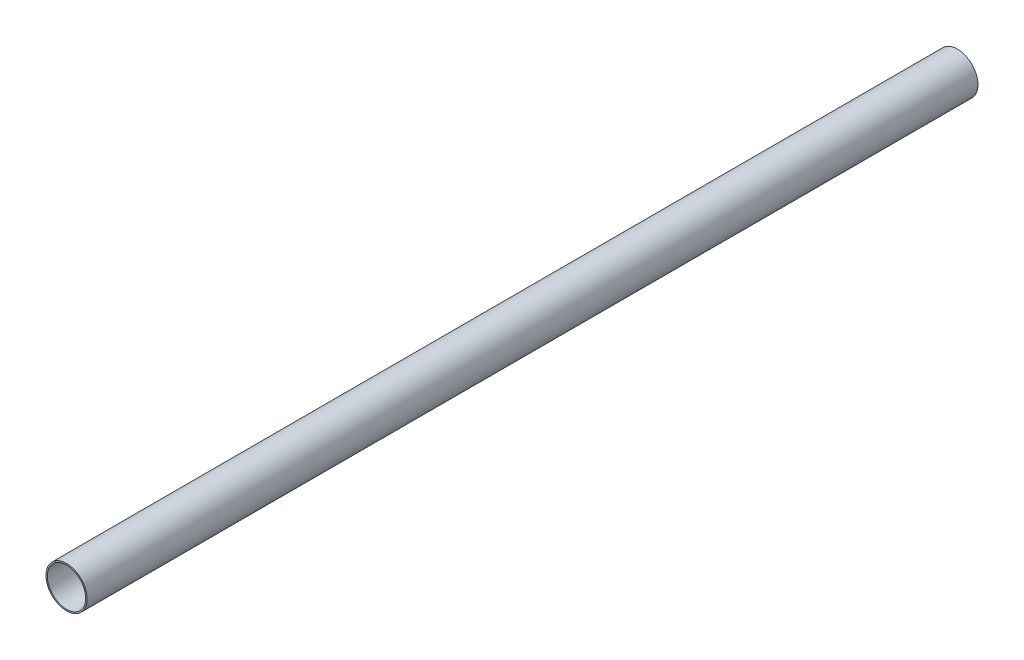
ISO-10303-21;
HEADER;
FILE_DESCRIPTION(('STEP AP214'),'2;1');
FILE_NAME('part.step','',(''),(''),'','','');
FILE_SCHEMA(('AUTOMOTIVE_DESIGN { 1 0 10303 214 1 1 1 1 }'));
ENDSEC;
DATA;
#1=APPLICATION_CONTEXT('core data for automotive mechanical design processes');
#2=APPLICATION_PROTOCOL_DEFINITION('international standard','automotive_design',2000,#1);
#3=PRODUCT_CONTEXT('',#1,'mechanical');
#4=PRODUCT('Part','Part','',(#3));
#5=PRODUCT_RELATED_PRODUCT_CATEGORY('part','',(#4));
#6=PRODUCT_DEFINITION_FORMATION('','',#4);
#7=PRODUCT_DEFINITION_CONTEXT('part definition',#1,'design');
#8=PRODUCT_DEFINITION('design','',#6,#7);
#9=PRODUCT_DEFINITION_SHAPE('','',#8);
#10=(LENGTH_UNIT() NAMED_UNIT(*) SI_UNIT(.MILLI.,.METRE.));
#11=(NAMED_UNIT(*) PLANE_ANGLE_UNIT() SI_UNIT($,.RADIAN.));
#12=(NAMED_UNIT(*) SI_UNIT($,.STERADIAN.) SOLID_ANGLE_UNIT());
#13=UNCERTAINTY_MEASURE_WITH_UNIT(LENGTH_MEASURE(1.E-05),#10,'distance_accuracy_value','');
#14=(GEOMETRIC_REPRESENTATION_CONTEXT(3) GLOBAL_UNCERTAINTY_ASSIGNED_CONTEXT((#13)) GLOBAL_UNIT_ASSIGNED_CONTEXT((#10,
#11,#12)) REPRESENTATION_CONTEXT('',''));
#15=CARTESIAN_POINT('',(0.,0.,0.));
#16=DIRECTION('',(0.,0.,1.));
#17=DIRECTION('',(1.,0.,0.));
#18=AXIS2_PLACEMENT_3D('',#15,#16,#17);
#19=CARTESIAN_POINT('',(0.,0.,325.));
#20=DIRECTION('',(0.,0.,1.));
#21=DIRECTION('',(1.,0.,0.));
#22=AXIS2_PLACEMENT_3D('',#19,#20,#21);
#23=PLANE('',#22);
#24=CARTESIAN_POINT('',(0.,0.,325.));
#25=DIRECTION('',(0.,0.,1.));
#26=DIRECTION('',(1.,0.,0.));
#27=AXIS2_PLACEMENT_3D('',#24,#25,#26);
#28=CIRCLE('',#27,15.);
#29=CARTESIAN_POINT('',(15.,0.,325.));
#30=VERTEX_POINT('',#29);
#31=EDGE_CURVE('E10',#30,#30,#28,.T.);
#32=ORIENTED_EDGE('',*,*,#31,.T.);
#33=EDGE_LOOP('',(#32));
#34=FACE_BOUND('',#33,.T.);
#35=CARTESIAN_POINT('',(0.,0.,325.));
#36=DIRECTION('',(0.,0.,1.));
#37=DIRECTION('',(1.,0.,0.));
#38=AXIS2_PLACEMENT_3D('',#35,#36,#37);
#39=CIRCLE('',#38,14.);
#40=CARTESIAN_POINT('',(14.,0.,325.));
#41=VERTEX_POINT('',#40);
#42=EDGE_CURVE('E44',#41,#41,#39,.T.);
#43=ORIENTED_EDGE('',*,*,#42,.F.);
#44=EDGE_LOOP('',(#43));
#45=FACE_BOUND('',#44,.T.);
#46=ADVANCED_FACE('F33',(#34,#45),#23,.T.);
#47=CARTESIAN_POINT('',(0.,0.,-325.));
#48=DIRECTION('',(0.,0.,1.));
#49=DIRECTION('',(1.,0.,0.));
#50=AXIS2_PLACEMENT_3D('',#47,#48,#49);
#51=PLANE('',#50);
#52=CARTESIAN_POINT('',(0.,0.,-325.));
#53=DIRECTION('',(0.,0.,1.));
#54=DIRECTION('',(1.,0.,0.));
#55=AXIS2_PLACEMENT_3D('',#52,#53,#54);
#56=CIRCLE('',#55,15.);
#57=CARTESIAN_POINT('',(15.,0.,-325.));
#58=VERTEX_POINT('',#57);
#59=EDGE_CURVE('E37',#58,#58,#56,.T.);
#60=ORIENTED_EDGE('',*,*,#59,.F.);
#61=EDGE_LOOP('',(#60));
#62=FACE_BOUND('',#61,.T.);
#63=CARTESIAN_POINT('',(0.,0.,-325.));
#64=DIRECTION('',(0.,0.,1.));
#65=DIRECTION('',(1.,0.,0.));
#66=AXIS2_PLACEMENT_3D('',#63,#64,#65);
#67=CIRCLE('',#66,14.);
#68=CARTESIAN_POINT('',(14.,0.,-325.));
#69=VERTEX_POINT('',#68);
#70=EDGE_CURVE('E46',#69,#69,#67,.T.);
#71=ORIENTED_EDGE('',*,*,#70,.T.);
#72=EDGE_LOOP('',(#71));
#73=FACE_BOUND('',#72,.T.);
#74=ADVANCED_FACE('F56',(#62,#73),#51,.F.);
#75=CARTESIAN_POINT('',(0.,0.,325.));
#76=DIRECTION('',(0.,0.,-1.));
#77=DIRECTION('',(-1.,0.,0.));
#78=AXIS2_PLACEMENT_3D('',#75,#76,#77);
#79=CYLINDRICAL_SURFACE('',#78,15.);
#80=ORIENTED_EDGE('',*,*,#31,.F.);
#81=EDGE_LOOP('',(#80));
#82=FACE_BOUND('',#81,.T.);
#83=ORIENTED_EDGE('',*,*,#59,.T.);
#84=EDGE_LOOP('',(#83));
#85=FACE_BOUND('',#84,.T.);
#86=ADVANCED_FACE('F35',(#82,#85),#79,.T.);
#87=CARTESIAN_POINT('',(0.,0.,325.));
#88=DIRECTION('',(0.,0.,-1.));
#89=DIRECTION('',(-1.,0.,0.));
#90=AXIS2_PLACEMENT_3D('',#87,#88,#89);
#91=CYLINDRICAL_SURFACE('',#90,14.);
#92=ORIENTED_EDGE('',*,*,#42,.T.);
#93=EDGE_LOOP('',(#92));
#94=FACE_BOUND('',#93,.T.);
#95=ORIENTED_EDGE('',*,*,#70,.F.);
#96=EDGE_LOOP('',(#95));
#97=FACE_BOUND('',#96,.T.);
#98=ADVANCED_FACE('F52',(#94,#97),#91,.F.);
#99=CLOSED_SHELL('',(#46,#74,#86,#98));
#100=MANIFOLD_SOLID_BREP('B2',#99);
#101=ADVANCED_BREP_SHAPE_REPRESENTATION('',(#18,#100),#14);
#102=SHAPE_DEFINITION_REPRESENTATION(#9,#101);
ENDSEC;
END-ISO-10303-21;
